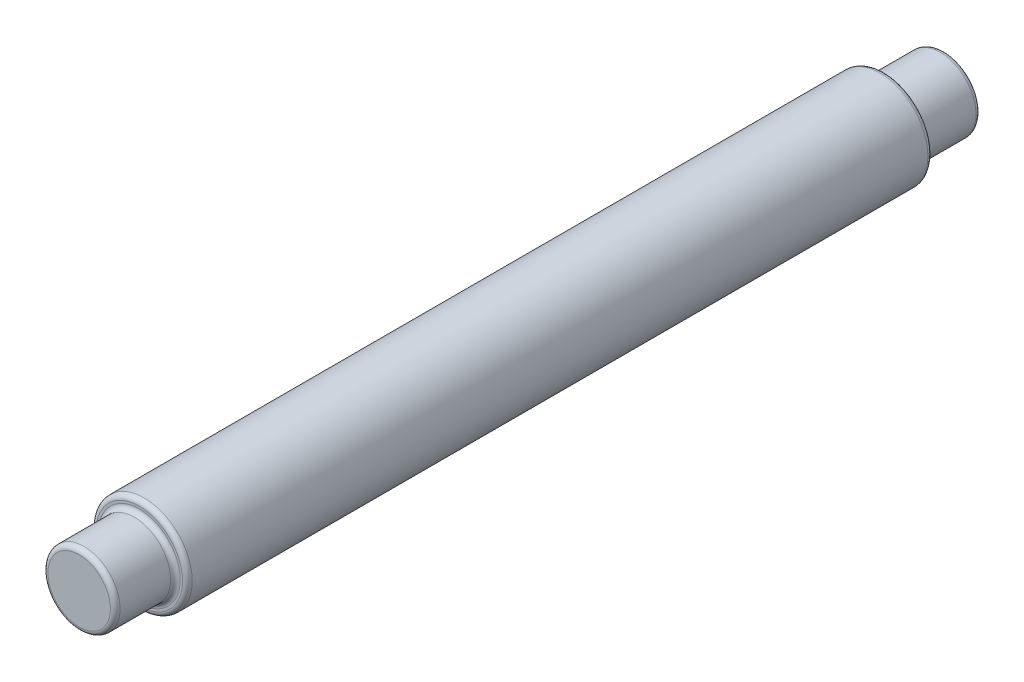
ISO-10303-21;
HEADER;
FILE_DESCRIPTION(('STEP AP214'),'2;1');
FILE_NAME('part.step','',(''),(''),'','','');
FILE_SCHEMA(('AUTOMOTIVE_DESIGN { 1 0 10303 214 1 1 1 1 }'));
ENDSEC;
DATA;
#1=APPLICATION_CONTEXT('core data for automotive mechanical design processes');
#2=APPLICATION_PROTOCOL_DEFINITION('international standard','automotive_design',2000,#1);
#3=PRODUCT_CONTEXT('',#1,'mechanical');
#4=PRODUCT('Part','Part','',(#3));
#5=PRODUCT_RELATED_PRODUCT_CATEGORY('part','',(#4));
#6=PRODUCT_DEFINITION_FORMATION('','',#4);
#7=PRODUCT_DEFINITION_CONTEXT('part definition',#1,'design');
#8=PRODUCT_DEFINITION('design','',#6,#7);
#9=PRODUCT_DEFINITION_SHAPE('','',#8);
#10=(LENGTH_UNIT() NAMED_UNIT(*) SI_UNIT(.MILLI.,.METRE.));
#11=(NAMED_UNIT(*) PLANE_ANGLE_UNIT() SI_UNIT($,.RADIAN.));
#12=(NAMED_UNIT(*) SI_UNIT($,.STERADIAN.) SOLID_ANGLE_UNIT());
#13=UNCERTAINTY_MEASURE_WITH_UNIT(LENGTH_MEASURE(1.E-05),#10,'distance_accuracy_value','');
#14=(GEOMETRIC_REPRESENTATION_CONTEXT(3) GLOBAL_UNCERTAINTY_ASSIGNED_CONTEXT((#13)) GLOBAL_UNIT_ASSIGNED_CONTEXT((#10,
#11,#12)) REPRESENTATION_CONTEXT('',''));
#15=CARTESIAN_POINT('',(0.,0.,0.));
#16=DIRECTION('',(0.,0.,1.));
#17=DIRECTION('',(1.,0.,0.));
#18=AXIS2_PLACEMENT_3D('',#15,#16,#17);
#19=CARTESIAN_POINT('',(0.,0.,7.75));
#20=DIRECTION('',(0.,0.,1.));
#21=DIRECTION('',(1.,0.,0.));
#22=AXIS2_PLACEMENT_3D('',#19,#20,#21);
#23=PLANE('',#22);
#24=CARTESIAN_POINT('',(0.,0.,7.75));
#25=DIRECTION('',(0.,0.,1.));
#26=DIRECTION('',(1.,0.,0.));
#27=AXIS2_PLACEMENT_3D('',#24,#25,#26);
#28=CIRCLE('',#27,0.899999999999999);
#29=CARTESIAN_POINT('',(0.899999999999999,0.,7.75));
#30=VERTEX_POINT('',#29);
#31=EDGE_CURVE('E67',#30,#30,#28,.T.);
#32=ORIENTED_EDGE('',*,*,#31,.T.);
#33=EDGE_LOOP('',(#32));
#34=FACE_BOUND('',#33,.T.);
#35=CARTESIAN_POINT('',(0.,0.,7.75));
#36=DIRECTION('',(0.,0.,1.));
#37=DIRECTION('',(1.,0.,0.));
#38=AXIS2_PLACEMENT_3D('',#35,#36,#37);
#39=CIRCLE('',#38,0.85);
#40=CARTESIAN_POINT('',(0.85,0.,7.75));
#41=VERTEX_POINT('',#40);
#42=EDGE_CURVE('E71',#41,#41,#39,.F.);
#43=ORIENTED_EDGE('',*,*,#42,.T.);
#44=EDGE_LOOP('',(#43));
#45=FACE_BOUND('',#44,.T.);
#46=ADVANCED_FACE('F34',(#34,#45),#23,.T.);
#47=CARTESIAN_POINT('',(0.,0.,-7.75));
#48=DIRECTION('',(0.,0.,1.));
#49=DIRECTION('',(1.,0.,0.));
#50=AXIS2_PLACEMENT_3D('',#47,#48,#49);
#51=PLANE('',#50);
#52=CARTESIAN_POINT('',(0.,0.,-7.75));
#53=DIRECTION('',(0.,0.,1.));
#54=DIRECTION('',(1.,0.,0.));
#55=AXIS2_PLACEMENT_3D('',#52,#53,#54);
#56=CIRCLE('',#55,0.85);
#57=CARTESIAN_POINT('',(0.85,0.,-7.75));
#58=VERTEX_POINT('',#57);
#59=EDGE_CURVE('E75',#58,#58,#56,.T.);
#60=ORIENTED_EDGE('',*,*,#59,.T.);
#61=EDGE_LOOP('',(#60));
#62=FACE_BOUND('',#61,.T.);
#63=CARTESIAN_POINT('',(0.,0.,-7.75));
#64=DIRECTION('',(0.,0.,1.));
#65=DIRECTION('',(1.,0.,0.));
#66=AXIS2_PLACEMENT_3D('',#63,#64,#65);
#67=CIRCLE('',#66,0.899999999999999);
#68=CARTESIAN_POINT('',(0.899999999999999,0.,-7.75));
#69=VERTEX_POINT('',#68);
#70=EDGE_CURVE('E79',#69,#69,#67,.F.);
#71=ORIENTED_EDGE('',*,*,#70,.T.);
#72=EDGE_LOOP('',(#71));
#73=FACE_BOUND('',#72,.T.);
#74=ADVANCED_FACE('F102',(#62,#73),#51,.F.);
#75=CARTESIAN_POINT('',(0.,0.,7.75));
#76=DIRECTION('',(0.,0.,-1.));
#77=DIRECTION('',(-1.,0.,0.));
#78=AXIS2_PLACEMENT_3D('',#75,#76,#77);
#79=CYLINDRICAL_SURFACE('',#78,0.999999999999999);
#80=CARTESIAN_POINT('',(0.,0.,7.65));
#81=DIRECTION('',(0.,0.,1.));
#82=DIRECTION('',(1.,0.,0.));
#83=AXIS2_PLACEMENT_3D('',#80,#81,#82);
#84=CIRCLE('',#83,0.999999999999999);
#85=CARTESIAN_POINT('',(0.999999999999999,0.,7.65));
#86=VERTEX_POINT('',#85);
#87=EDGE_CURVE('E60',#86,#86,#84,.F.);
#88=ORIENTED_EDGE('',*,*,#87,.T.);
#89=EDGE_LOOP('',(#88));
#90=FACE_BOUND('',#89,.T.);
#91=CARTESIAN_POINT('',(0.,0.,-7.65));
#92=DIRECTION('',(0.,0.,1.));
#93=DIRECTION('',(1.,0.,0.));
#94=AXIS2_PLACEMENT_3D('',#91,#92,#93);
#95=CIRCLE('',#94,0.999999999999999);
#96=CARTESIAN_POINT('',(0.999999999999999,0.,-7.65));
#97=VERTEX_POINT('',#96);
#98=EDGE_CURVE('E64',#97,#97,#95,.T.);
#99=ORIENTED_EDGE('',*,*,#98,.T.);
#100=EDGE_LOOP('',(#99));
#101=FACE_BOUND('',#100,.T.);
#102=ADVANCED_FACE('F108',(#90,#101),#79,.T.);
#103=CARTESIAN_POINT('',(0.,0.,-9.));
#104=DIRECTION('',(0.,0.,1.));
#105=DIRECTION('',(1.,0.,0.));
#106=AXIS2_PLACEMENT_3D('',#103,#104,#105);
#107=PLANE('',#106);
#108=CARTESIAN_POINT('',(0.,0.,-9.));
#109=DIRECTION('',(0.,0.,1.));
#110=DIRECTION('',(1.,0.,0.));
#111=AXIS2_PLACEMENT_3D('',#108,#109,#110);
#112=CIRCLE('',#111,0.65);
#113=CARTESIAN_POINT('',(0.65,0.,-9.));
#114=VERTEX_POINT('',#113);
#115=EDGE_CURVE('E10',#114,#114,#112,.F.);
#116=ORIENTED_EDGE('',*,*,#115,.T.);
#117=EDGE_LOOP('',(#116));
#118=FACE_BOUND('',#117,.T.);
#119=ADVANCED_FACE('F118',(#118),#107,.F.);
#120=CARTESIAN_POINT('',(0.,0.,9.));
#121=DIRECTION('',(0.,0.,-1.));
#122=DIRECTION('',(-1.,0.,0.));
#123=AXIS2_PLACEMENT_3D('',#120,#121,#122);
#124=CYLINDRICAL_SURFACE('',#123,0.75);
#125=CARTESIAN_POINT('',(0.,0.,-7.85));
#126=DIRECTION('',(0.,0.,1.));
#127=DIRECTION('',(1.,0.,0.));
#128=AXIS2_PLACEMENT_3D('',#125,#126,#127);
#129=CIRCLE('',#128,0.75);
#130=CARTESIAN_POINT('',(0.75,0.,-7.85));
#131=VERTEX_POINT('',#130);
#132=EDGE_CURVE('E83',#131,#131,#129,.F.);
#133=ORIENTED_EDGE('',*,*,#132,.T.);
#134=EDGE_LOOP('',(#133));
#135=FACE_BOUND('',#134,.T.);
#136=CARTESIAN_POINT('',(0.,0.,-8.9));
#137=DIRECTION('',(0.,0.,1.));
#138=DIRECTION('',(1.,0.,0.));
#139=AXIS2_PLACEMENT_3D('',#136,#137,#138);
#140=CIRCLE('',#139,0.75);
#141=CARTESIAN_POINT('',(0.75,0.,-8.9));
#142=VERTEX_POINT('',#141);
#143=EDGE_CURVE('E87',#142,#142,#140,.T.);
#144=ORIENTED_EDGE('',*,*,#143,.T.);
#145=EDGE_LOOP('',(#144));
#146=FACE_BOUND('',#145,.T.);
#147=ADVANCED_FACE('F91',(#135,#146),#124,.T.);
#148=CARTESIAN_POINT('',(0.,0.,7.85));
#149=DIRECTION('',(0.,0.,1.));
#150=DIRECTION('',(1.,0.,0.));
#151=AXIS2_PLACEMENT_3D('',#148,#149,#150);
#152=CIRCLE('',#151,0.75);
#153=CARTESIAN_POINT('',(0.75,0.,7.85));
#154=VERTEX_POINT('',#153);
#155=EDGE_CURVE('E49',#154,#154,#152,.T.);
#156=ORIENTED_EDGE('',*,*,#155,.T.);
#157=EDGE_LOOP('',(#156));
#158=FACE_BOUND('',#157,.T.);
#159=CARTESIAN_POINT('',(0.,0.,8.9));
#160=DIRECTION('',(0.,0.,1.));
#161=DIRECTION('',(1.,0.,0.));
#162=AXIS2_PLACEMENT_3D('',#159,#160,#161);
#163=CIRCLE('',#162,0.75);
#164=CARTESIAN_POINT('',(0.75,0.,8.9));
#165=VERTEX_POINT('',#164);
#166=EDGE_CURVE('E55',#165,#165,#163,.F.);
#167=ORIENTED_EDGE('',*,*,#166,.T.);
#168=EDGE_LOOP('',(#167));
#169=FACE_BOUND('',#168,.T.);
#170=ADVANCED_FACE('F113',(#158,#169),#124,.T.);
#171=CARTESIAN_POINT('',(0.,0.,9.));
#172=DIRECTION('',(0.,0.,1.));
#173=DIRECTION('',(1.,0.,0.));
#174=AXIS2_PLACEMENT_3D('',#171,#172,#173);
#175=PLANE('',#174);
#176=CARTESIAN_POINT('',(0.,0.,9.));
#177=DIRECTION('',(0.,0.,1.));
#178=DIRECTION('',(1.,0.,0.));
#179=AXIS2_PLACEMENT_3D('',#176,#177,#178);
#180=CIRCLE('',#179,0.65);
#181=CARTESIAN_POINT('',(0.65,0.,9.));
#182=VERTEX_POINT('',#181);
#183=EDGE_CURVE('E42',#182,#182,#180,.T.);
#184=ORIENTED_EDGE('',*,*,#183,.T.);
#185=EDGE_LOOP('',(#184));
#186=FACE_BOUND('',#185,.T.);
#187=ADVANCED_FACE('F124',(#186),#175,.T.);
#188=CARTESIAN_POINT('',(0.,0.,-7.85));
#189=DIRECTION('',(0.,0.,1.));
#190=DIRECTION('',(1.,0.,0.));
#191=AXIS2_PLACEMENT_3D('',#188,#189,#190);
#192=TOROIDAL_SURFACE('',#191,0.85,0.1);
#193=ORIENTED_EDGE('',*,*,#59,.F.);
#194=EDGE_LOOP('',(#193));
#195=FACE_BOUND('',#194,.T.);
#196=ORIENTED_EDGE('',*,*,#132,.F.);
#197=EDGE_LOOP('',(#196));
#198=FACE_BOUND('',#197,.T.);
#199=ADVANCED_FACE('F120',(#195,#198),#192,.F.);
#200=CARTESIAN_POINT('',(0.,0.,7.65));
#201=DIRECTION('',(0.,0.,1.));
#202=DIRECTION('',(1.,0.,0.));
#203=AXIS2_PLACEMENT_3D('',#200,#201,#202);
#204=TOROIDAL_SURFACE('',#203,0.899999999999999,0.1);
#205=ORIENTED_EDGE('',*,*,#87,.F.);
#206=EDGE_LOOP('',(#205));
#207=FACE_BOUND('',#206,.T.);
#208=ORIENTED_EDGE('',*,*,#31,.F.);
#209=EDGE_LOOP('',(#208));
#210=FACE_BOUND('',#209,.T.);
#211=ADVANCED_FACE('F123',(#207,#210),#204,.T.);
#212=CARTESIAN_POINT('',(0.,0.,-7.65));
#213=DIRECTION('',(0.,0.,1.));
#214=DIRECTION('',(1.,0.,0.));
#215=AXIS2_PLACEMENT_3D('',#212,#213,#214);
#216=TOROIDAL_SURFACE('',#215,0.899999999999999,0.1);
#217=ORIENTED_EDGE('',*,*,#70,.F.);
#218=EDGE_LOOP('',(#217));
#219=FACE_BOUND('',#218,.T.);
#220=ORIENTED_EDGE('',*,*,#98,.F.);
#221=EDGE_LOOP('',(#220));
#222=FACE_BOUND('',#221,.T.);
#223=ADVANCED_FACE('F128',(#219,#222),#216,.T.);
#224=CARTESIAN_POINT('',(0.,0.,7.85));
#225=DIRECTION('',(0.,0.,1.));
#226=DIRECTION('',(1.,0.,0.));
#227=AXIS2_PLACEMENT_3D('',#224,#225,#226);
#228=TOROIDAL_SURFACE('',#227,0.85,0.1);
#229=ORIENTED_EDGE('',*,*,#155,.F.);
#230=EDGE_LOOP('',(#229));
#231=FACE_BOUND('',#230,.T.);
#232=ORIENTED_EDGE('',*,*,#42,.F.);
#233=EDGE_LOOP('',(#232));
#234=FACE_BOUND('',#233,.T.);
#235=ADVANCED_FACE('F99',(#231,#234),#228,.F.);
#236=CARTESIAN_POINT('',(0.,0.,8.9));
#237=DIRECTION('',(0.,0.,1.));
#238=DIRECTION('',(1.,0.,0.));
#239=AXIS2_PLACEMENT_3D('',#236,#237,#238);
#240=TOROIDAL_SURFACE('',#239,0.65,0.1);
#241=ORIENTED_EDGE('',*,*,#166,.F.);
#242=EDGE_LOOP('',(#241));
#243=FACE_BOUND('',#242,.T.);
#244=ORIENTED_EDGE('',*,*,#183,.F.);
#245=EDGE_LOOP('',(#244));
#246=FACE_BOUND('',#245,.T.);
#247=ADVANCED_FACE('F94',(#243,#246),#240,.T.);
#248=CARTESIAN_POINT('',(0.,0.,-8.9));
#249=DIRECTION('',(0.,0.,1.));
#250=DIRECTION('',(1.,0.,0.));
#251=AXIS2_PLACEMENT_3D('',#248,#249,#250);
#252=TOROIDAL_SURFACE('',#251,0.65,0.1);
#253=ORIENTED_EDGE('',*,*,#115,.F.);
#254=EDGE_LOOP('',(#253));
#255=FACE_BOUND('',#254,.T.);
#256=ORIENTED_EDGE('',*,*,#143,.F.);
#257=EDGE_LOOP('',(#256));
#258=FACE_BOUND('',#257,.T.);
#259=ADVANCED_FACE('F36',(#255,#258),#252,.T.);
#260=CLOSED_SHELL('',(#46,#74,#102,#119,#147,#170,#187,#199,#211,#223,#235,#247,#259));
#261=MANIFOLD_SOLID_BREP('B2',#260);
#262=ADVANCED_BREP_SHAPE_REPRESENTATION('',(#18,#261),#14);
#263=SHAPE_DEFINITION_REPRESENTATION(#9,#262);
ENDSEC;
END-ISO-10303-21;
